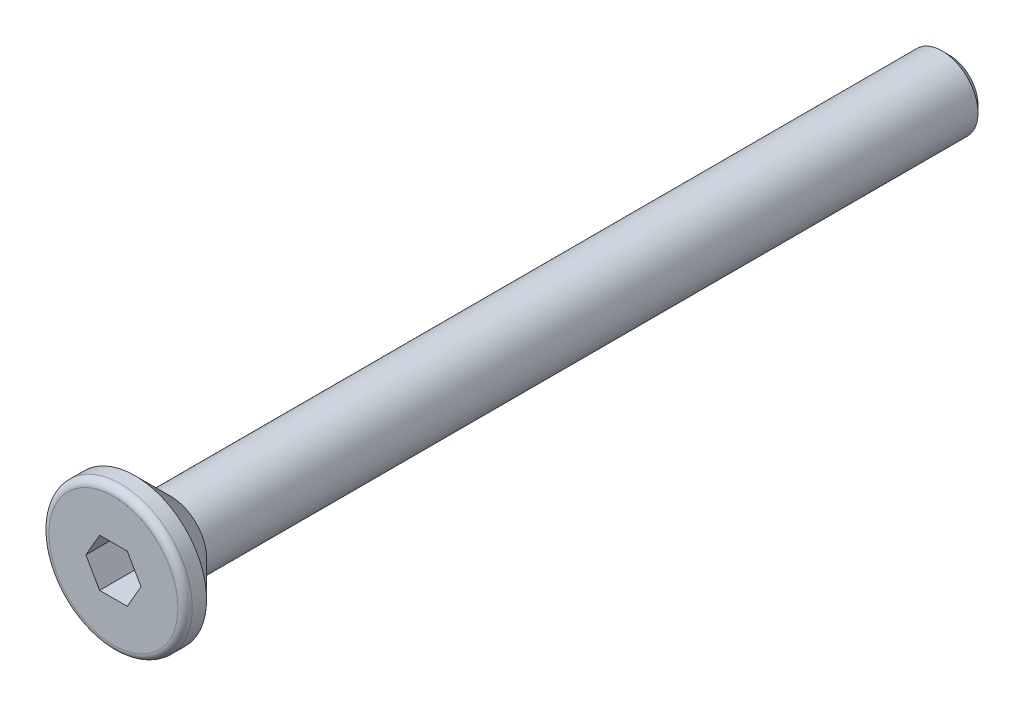
ISO-10303-21;
HEADER;
FILE_DESCRIPTION(('STEP AP214'),'2;1');
FILE_NAME('part.step','',(''),(''),'','','');
FILE_SCHEMA(('AUTOMOTIVE_DESIGN { 1 0 10303 214 1 1 1 1 }'));
ENDSEC;
DATA;
#1=APPLICATION_CONTEXT('core data for automotive mechanical design processes');
#2=APPLICATION_PROTOCOL_DEFINITION('international standard','automotive_design',2000,#1);
#3=PRODUCT_CONTEXT('',#1,'mechanical');
#4=PRODUCT('Part','Part','',(#3));
#5=PRODUCT_RELATED_PRODUCT_CATEGORY('part','',(#4));
#6=PRODUCT_DEFINITION_FORMATION('','',#4);
#7=PRODUCT_DEFINITION_CONTEXT('part definition',#1,'design');
#8=PRODUCT_DEFINITION('design','',#6,#7);
#9=PRODUCT_DEFINITION_SHAPE('','',#8);
#10=(LENGTH_UNIT() NAMED_UNIT(*) SI_UNIT(.MILLI.,.METRE.));
#11=(NAMED_UNIT(*) PLANE_ANGLE_UNIT() SI_UNIT($,.RADIAN.));
#12=(NAMED_UNIT(*) SI_UNIT($,.STERADIAN.) SOLID_ANGLE_UNIT());
#13=UNCERTAINTY_MEASURE_WITH_UNIT(LENGTH_MEASURE(1.E-05),#10,'distance_accuracy_value','');
#14=(GEOMETRIC_REPRESENTATION_CONTEXT(3) GLOBAL_UNCERTAINTY_ASSIGNED_CONTEXT((#13)) GLOBAL_UNIT_ASSIGNED_CONTEXT((#10,
#11,#12)) REPRESENTATION_CONTEXT('',''));
#15=CARTESIAN_POINT('',(0.,0.,0.));
#16=DIRECTION('',(0.,0.,1.));
#17=DIRECTION('',(1.,0.,0.));
#18=AXIS2_PLACEMENT_3D('',#15,#16,#17);
#19=CARTESIAN_POINT('',(0.,0.,17.5));
#20=DIRECTION('',(0.,0.,1.));
#21=DIRECTION('',(1.,0.,0.));
#22=AXIS2_PLACEMENT_3D('',#19,#20,#21);
#23=PLANE('',#22);
#24=CARTESIAN_POINT('',(0.,0.,17.5));
#25=DIRECTION('',(0.,0.,1.));
#26=DIRECTION('',(1.,0.,0.));
#27=AXIS2_PLACEMENT_3D('',#24,#25,#26);
#28=CIRCLE('',#27,2.7);
#29=CARTESIAN_POINT('',(2.7,0.,17.5));
#30=VERTEX_POINT('',#29);
#31=EDGE_CURVE('E11',#30,#30,#28,.T.);
#32=ORIENTED_EDGE('',*,*,#31,.T.);
#33=EDGE_LOOP('',(#32));
#34=FACE_BOUND('',#33,.T.);
#35=DIRECTION('',(0.5,0.866025403784439,0.));
#36=VECTOR('',#35,1.);
#37=CARTESIAN_POINT('',(0.577350269189626,-1.,17.5));
#38=LINE('',#37,#36);
#39=CARTESIAN_POINT('',(0.577350269189626,-1.,17.5));
#40=VERTEX_POINT('',#39);
#41=CARTESIAN_POINT('',(1.15470053837925,0.,17.5));
#42=VERTEX_POINT('',#41);
#43=EDGE_CURVE('E48',#40,#42,#38,.T.);
#44=ORIENTED_EDGE('',*,*,#43,.F.);
#45=DIRECTION('',(1.,0.,0.));
#46=VECTOR('',#45,1.);
#47=CARTESIAN_POINT('',(-0.577350269189626,-1.,17.5));
#48=LINE('',#47,#46);
#49=CARTESIAN_POINT('',(-0.577350269189626,-1.,17.5));
#50=VERTEX_POINT('',#49);
#51=EDGE_CURVE('E131',#50,#40,#48,.T.);
#52=ORIENTED_EDGE('',*,*,#51,.F.);
#53=DIRECTION('',(0.5,-0.866025403784438,0.));
#54=VECTOR('',#53,1.);
#55=CARTESIAN_POINT('',(-1.15470053837925,0.,17.5));
#56=LINE('',#55,#54);
#57=CARTESIAN_POINT('',(-1.15470053837925,0.,17.5));
#58=VERTEX_POINT('',#57);
#59=EDGE_CURVE('E129',#58,#50,#56,.T.);
#60=ORIENTED_EDGE('',*,*,#59,.F.);
#61=DIRECTION('',(-0.5,-0.866025403784439,0.));
#62=VECTOR('',#61,1.);
#63=CARTESIAN_POINT('',(-0.577350269189626,1.,17.5));
#64=LINE('',#63,#62);
#65=CARTESIAN_POINT('',(-0.577350269189626,1.,17.5));
#66=VERTEX_POINT('',#65);
#67=EDGE_CURVE('E96',#66,#58,#64,.T.);
#68=ORIENTED_EDGE('',*,*,#67,.F.);
#69=DIRECTION('',(-1.,0.,0.));
#70=VECTOR('',#69,1.);
#71=CARTESIAN_POINT('',(0.577350269189626,1.,17.5));
#72=LINE('',#71,#70);
#73=CARTESIAN_POINT('',(0.577350269189626,1.,17.5));
#74=VERTEX_POINT('',#73);
#75=EDGE_CURVE('E125',#74,#66,#72,.T.);
#76=ORIENTED_EDGE('',*,*,#75,.F.);
#77=DIRECTION('',(-0.5,0.866025403784438,0.));
#78=VECTOR('',#77,1.);
#79=CARTESIAN_POINT('',(1.15470053837925,0.,17.5));
#80=LINE('',#79,#78);
#81=EDGE_CURVE('E122',#42,#74,#80,.T.);
#82=ORIENTED_EDGE('',*,*,#81,.F.);
#83=EDGE_LOOP('',(#44,#52,#60,#68,#76,#82));
#84=FACE_BOUND('',#83,.T.);
#85=ADVANCED_FACE('F33',(#34,#84),#23,.T.);
#86=CARTESIAN_POINT('',(0.,0.,-17.5));
#87=DIRECTION('',(0.,0.,-1.));
#88=DIRECTION('',(-1.,0.,0.));
#89=AXIS2_PLACEMENT_3D('',#86,#87,#88);
#90=CYLINDRICAL_SURFACE('',#89,3.);
#91=CARTESIAN_POINT('',(0.,0.,17.2));
#92=DIRECTION('',(0.,0.,1.));
#93=DIRECTION('',(1.,0.,0.));
#94=AXIS2_PLACEMENT_3D('',#91,#92,#93);
#95=CIRCLE('',#94,3.);
#96=CARTESIAN_POINT('',(3.,0.,17.2));
#97=VERTEX_POINT('',#96);
#98=EDGE_CURVE('E41',#97,#97,#95,.F.);
#99=ORIENTED_EDGE('',*,*,#98,.T.);
#100=EDGE_LOOP('',(#99));
#101=FACE_BOUND('',#100,.T.);
#102=CARTESIAN_POINT('',(0.,0.,16.6));
#103=DIRECTION('',(0.,0.,-1.));
#104=DIRECTION('',(-1.,0.,0.));
#105=AXIS2_PLACEMENT_3D('',#102,#103,#104);
#106=CIRCLE('',#105,3.);
#107=CARTESIAN_POINT('',(-3.,0.,16.6));
#108=VERTEX_POINT('',#107);
#109=EDGE_CURVE('E149',#108,#108,#106,.T.);
#110=ORIENTED_EDGE('',*,*,#109,.F.);
#111=EDGE_LOOP('',(#110));
#112=FACE_BOUND('',#111,.T.);
#113=ADVANCED_FACE('F154',(#101,#112),#90,.T.);
#114=CARTESIAN_POINT('',(0.,0.,15.1));
#115=DIRECTION('',(0.,0.,1.));
#116=DIRECTION('',(1.,0.,0.));
#117=AXIS2_PLACEMENT_3D('',#114,#115,#116);
#118=CONICAL_SURFACE('',#117,1.5,0.785398163397443);
#119=ORIENTED_EDGE('',*,*,#109,.T.);
#120=EDGE_LOOP('',(#119));
#121=FACE_BOUND('',#120,.T.);
#122=CARTESIAN_POINT('',(0.,0.,15.1));
#123=DIRECTION('',(0.,0.,-1.));
#124=DIRECTION('',(-1.,0.,0.));
#125=AXIS2_PLACEMENT_3D('',#122,#123,#124);
#126=CIRCLE('',#125,1.5);
#127=CARTESIAN_POINT('',(-1.5,0.,15.1));
#128=VERTEX_POINT('',#127);
#129=EDGE_CURVE('E146',#128,#128,#126,.T.);
#130=ORIENTED_EDGE('',*,*,#129,.F.);
#131=EDGE_LOOP('',(#130));
#132=FACE_BOUND('',#131,.T.);
#133=ADVANCED_FACE('F170',(#121,#132),#118,.T.);
#134=CARTESIAN_POINT('',(0.,0.,-17.5));
#135=DIRECTION('',(0.,0.,-1.));
#136=DIRECTION('',(-1.,0.,0.));
#137=AXIS2_PLACEMENT_3D('',#134,#135,#136);
#138=CYLINDRICAL_SURFACE('',#137,1.5);
#139=ORIENTED_EDGE('',*,*,#129,.T.);
#140=EDGE_LOOP('',(#139));
#141=FACE_BOUND('',#140,.T.);
#142=CARTESIAN_POINT('',(0.,0.,-17.2));
#143=DIRECTION('',(0.,0.,-1.));
#144=DIRECTION('',(-1.,0.,0.));
#145=AXIS2_PLACEMENT_3D('',#142,#143,#144);
#146=CIRCLE('',#145,1.5);
#147=CARTESIAN_POINT('',(-1.5,0.,-17.2));
#148=VERTEX_POINT('',#147);
#149=EDGE_CURVE('E143',#148,#148,#146,.T.);
#150=ORIENTED_EDGE('',*,*,#149,.F.);
#151=EDGE_LOOP('',(#150));
#152=FACE_BOUND('',#151,.T.);
#153=ADVANCED_FACE('F176',(#141,#152),#138,.T.);
#154=CARTESIAN_POINT('',(0.,0.,-17.5));
#155=DIRECTION('',(0.,0.,1.));
#156=DIRECTION('',(1.,0.,0.));
#157=AXIS2_PLACEMENT_3D('',#154,#155,#156);
#158=CONICAL_SURFACE('',#157,1.2,0.785398163397443);
#159=ORIENTED_EDGE('',*,*,#149,.T.);
#160=EDGE_LOOP('',(#159));
#161=FACE_BOUND('',#160,.T.);
#162=CARTESIAN_POINT('',(0.,0.,-17.5));
#163=DIRECTION('',(0.,0.,-1.));
#164=DIRECTION('',(-1.,0.,0.));
#165=AXIS2_PLACEMENT_3D('',#162,#163,#164);
#166=CIRCLE('',#165,1.2);
#167=CARTESIAN_POINT('',(-1.2,0.,-17.5));
#168=VERTEX_POINT('',#167);
#169=EDGE_CURVE('E135',#168,#168,#166,.T.);
#170=ORIENTED_EDGE('',*,*,#169,.F.);
#171=EDGE_LOOP('',(#170));
#172=FACE_BOUND('',#171,.T.);
#173=ADVANCED_FACE('F180',(#161,#172),#158,.T.);
#174=CARTESIAN_POINT('',(0.,1.2,-17.5));
#175=DIRECTION('',(0.,0.,-1.));
#176=DIRECTION('',(-1.,0.,0.));
#177=AXIS2_PLACEMENT_3D('',#174,#175,#176);
#178=PLANE('',#177);
#179=ORIENTED_EDGE('',*,*,#169,.T.);
#180=EDGE_LOOP('',(#179));
#181=FACE_BOUND('',#180,.T.);
#182=ADVANCED_FACE('F184',(#181),#178,.T.);
#183=CARTESIAN_POINT('',(0.577350269189626,-1.,16.));
#184=DIRECTION('',(0.866025403784438,-0.5,0.));
#185=DIRECTION('',(0.5,0.866025403784439,0.));
#186=AXIS2_PLACEMENT_3D('',#183,#184,#185);
#187=PLANE('',#186);
#188=ORIENTED_EDGE('',*,*,#43,.T.);
#189=DIRECTION('',(0.,0.,1.));
#190=VECTOR('',#189,1.);
#191=CARTESIAN_POINT('',(1.15470053837925,0.,16.));
#192=LINE('',#191,#190);
#193=CARTESIAN_POINT('',(1.15470053837925,0.,16.));
#194=VERTEX_POINT('',#193);
#195=EDGE_CURVE('E78',#194,#42,#192,.T.);
#196=ORIENTED_EDGE('',*,*,#195,.F.);
#197=DIRECTION('',(0.5,0.866025403784439,0.));
#198=VECTOR('',#197,1.);
#199=CARTESIAN_POINT('',(0.577350269189626,-1.,16.));
#200=LINE('',#199,#198);
#201=CARTESIAN_POINT('',(0.577350269189626,-1.,16.));
#202=VERTEX_POINT('',#201);
#203=EDGE_CURVE('E133',#202,#194,#200,.T.);
#204=ORIENTED_EDGE('',*,*,#203,.F.);
#205=DIRECTION('',(0.,0.,1.));
#206=VECTOR('',#205,1.);
#207=CARTESIAN_POINT('',(0.577350269189626,-1.,16.));
#208=LINE('',#207,#206);
#209=EDGE_CURVE('E56',#202,#40,#208,.T.);
#210=ORIENTED_EDGE('',*,*,#209,.T.);
#211=EDGE_LOOP('',(#188,#196,#204,#210));
#212=FACE_BOUND('',#211,.T.);
#213=ADVANCED_FACE('F188',(#212),#187,.F.);
#214=CARTESIAN_POINT('',(-0.577350269189626,-1.,16.));
#215=DIRECTION('',(0.,-1.,0.));
#216=DIRECTION('',(1.,0.,0.));
#217=AXIS2_PLACEMENT_3D('',#214,#215,#216);
#218=PLANE('',#217);
#219=ORIENTED_EDGE('',*,*,#51,.T.);
#220=ORIENTED_EDGE('',*,*,#209,.F.);
#221=DIRECTION('',(1.,0.,0.));
#222=VECTOR('',#221,1.);
#223=CARTESIAN_POINT('',(-0.577350269189626,-1.,16.));
#224=LINE('',#223,#222);
#225=CARTESIAN_POINT('',(-0.577350269189626,-1.,16.));
#226=VERTEX_POINT('',#225);
#227=EDGE_CURVE('E108',#226,#202,#224,.T.);
#228=ORIENTED_EDGE('',*,*,#227,.F.);
#229=DIRECTION('',(0.,0.,1.));
#230=VECTOR('',#229,1.);
#231=CARTESIAN_POINT('',(-0.577350269189626,-1.,16.));
#232=LINE('',#231,#230);
#233=EDGE_CURVE('E100',#226,#50,#232,.T.);
#234=ORIENTED_EDGE('',*,*,#233,.T.);
#235=EDGE_LOOP('',(#219,#220,#228,#234));
#236=FACE_BOUND('',#235,.T.);
#237=ADVANCED_FACE('F192',(#236),#218,.F.);
#238=CARTESIAN_POINT('',(-1.15470053837925,0.,16.));
#239=DIRECTION('',(-0.866025403784439,-0.5,0.));
#240=DIRECTION('',(0.5,-0.866025403784439,0.));
#241=AXIS2_PLACEMENT_3D('',#238,#239,#240);
#242=PLANE('',#241);
#243=ORIENTED_EDGE('',*,*,#59,.T.);
#244=ORIENTED_EDGE('',*,*,#233,.F.);
#245=DIRECTION('',(0.5,-0.866025403784438,0.));
#246=VECTOR('',#245,1.);
#247=CARTESIAN_POINT('',(-1.15470053837925,0.,16.));
#248=LINE('',#247,#246);
#249=CARTESIAN_POINT('',(-1.15470053837925,0.,16.));
#250=VERTEX_POINT('',#249);
#251=EDGE_CURVE('E104',#250,#226,#248,.T.);
#252=ORIENTED_EDGE('',*,*,#251,.F.);
#253=DIRECTION('',(0.,0.,1.));
#254=VECTOR('',#253,1.);
#255=CARTESIAN_POINT('',(-1.15470053837925,0.,16.));
#256=LINE('',#255,#254);
#257=EDGE_CURVE('E89',#250,#58,#256,.T.);
#258=ORIENTED_EDGE('',*,*,#257,.T.);
#259=EDGE_LOOP('',(#243,#244,#252,#258));
#260=FACE_BOUND('',#259,.T.);
#261=ADVANCED_FACE('F105',(#260),#242,.F.);
#262=CARTESIAN_POINT('',(-0.577350269189626,1.,16.));
#263=DIRECTION('',(-0.866025403784439,0.5,0.));
#264=DIRECTION('',(-0.5,-0.866025403784439,0.));
#265=AXIS2_PLACEMENT_3D('',#262,#263,#264);
#266=PLANE('',#265);
#267=ORIENTED_EDGE('',*,*,#67,.T.);
#268=ORIENTED_EDGE('',*,*,#257,.F.);
#269=DIRECTION('',(-0.5,-0.866025403784439,0.));
#270=VECTOR('',#269,1.);
#271=CARTESIAN_POINT('',(-0.577350269189626,1.,16.));
#272=LINE('',#271,#270);
#273=CARTESIAN_POINT('',(-0.577350269189626,1.,16.));
#274=VERTEX_POINT('',#273);
#275=EDGE_CURVE('E93',#274,#250,#272,.T.);
#276=ORIENTED_EDGE('',*,*,#275,.F.);
#277=DIRECTION('',(0.,0.,1.));
#278=VECTOR('',#277,1.);
#279=CARTESIAN_POINT('',(-0.577350269189626,1.,16.));
#280=LINE('',#279,#278);
#281=EDGE_CURVE('E101',#274,#66,#280,.T.);
#282=ORIENTED_EDGE('',*,*,#281,.T.);
#283=EDGE_LOOP('',(#267,#268,#276,#282));
#284=FACE_BOUND('',#283,.T.);
#285=ADVANCED_FACE('F91',(#284),#266,.F.);
#286=CARTESIAN_POINT('',(0.577350269189626,1.,16.));
#287=DIRECTION('',(0.,1.,0.));
#288=DIRECTION('',(-1.,0.,0.));
#289=AXIS2_PLACEMENT_3D('',#286,#287,#288);
#290=PLANE('',#289);
#291=ORIENTED_EDGE('',*,*,#75,.T.);
#292=ORIENTED_EDGE('',*,*,#281,.F.);
#293=DIRECTION('',(-1.,0.,0.));
#294=VECTOR('',#293,1.);
#295=CARTESIAN_POINT('',(0.577350269189626,1.,16.));
#296=LINE('',#295,#294);
#297=CARTESIAN_POINT('',(0.577350269189626,1.,16.));
#298=VERTEX_POINT('',#297);
#299=EDGE_CURVE('E114',#298,#274,#296,.T.);
#300=ORIENTED_EDGE('',*,*,#299,.F.);
#301=DIRECTION('',(0.,0.,1.));
#302=VECTOR('',#301,1.);
#303=CARTESIAN_POINT('',(0.577350269189626,1.,16.));
#304=LINE('',#303,#302);
#305=EDGE_CURVE('E138',#298,#74,#304,.T.);
#306=ORIENTED_EDGE('',*,*,#305,.T.);
#307=EDGE_LOOP('',(#291,#292,#300,#306));
#308=FACE_BOUND('',#307,.T.);
#309=ADVANCED_FACE('F195',(#308),#290,.F.);
#310=CARTESIAN_POINT('',(1.15470053837925,0.,16.));
#311=DIRECTION('',(0.866025403784439,0.5,0.));
#312=DIRECTION('',(-0.5,0.866025403784439,0.));
#313=AXIS2_PLACEMENT_3D('',#310,#311,#312);
#314=PLANE('',#313);
#315=ORIENTED_EDGE('',*,*,#81,.T.);
#316=ORIENTED_EDGE('',*,*,#305,.F.);
#317=DIRECTION('',(-0.5,0.866025403784438,0.));
#318=VECTOR('',#317,1.);
#319=CARTESIAN_POINT('',(1.15470053837925,0.,16.));
#320=LINE('',#319,#318);
#321=EDGE_CURVE('E116',#194,#298,#320,.T.);
#322=ORIENTED_EDGE('',*,*,#321,.F.);
#323=ORIENTED_EDGE('',*,*,#195,.T.);
#324=EDGE_LOOP('',(#315,#316,#322,#323));
#325=FACE_BOUND('',#324,.T.);
#326=ADVANCED_FACE('F162',(#325),#314,.F.);
#327=CARTESIAN_POINT('',(0.,0.,16.));
#328=DIRECTION('',(0.,0.,1.));
#329=DIRECTION('',(1.,0.,0.));
#330=AXIS2_PLACEMENT_3D('',#327,#328,#329);
#331=PLANE('',#330);
#332=ORIENTED_EDGE('',*,*,#203,.T.);
#333=ORIENTED_EDGE('',*,*,#321,.T.);
#334=ORIENTED_EDGE('',*,*,#299,.T.);
#335=ORIENTED_EDGE('',*,*,#275,.T.);
#336=ORIENTED_EDGE('',*,*,#251,.T.);
#337=ORIENTED_EDGE('',*,*,#227,.T.);
#338=EDGE_LOOP('',(#332,#333,#334,#335,#336,#337));
#339=FACE_BOUND('',#338,.T.);
#340=ADVANCED_FACE('F111',(#339),#331,.T.);
#341=CARTESIAN_POINT('',(0.,0.,17.2));
#342=DIRECTION('',(0.,0.,1.));
#343=DIRECTION('',(1.,0.,0.));
#344=AXIS2_PLACEMENT_3D('',#341,#342,#343);
#345=TOROIDAL_SURFACE('',#344,2.7,0.3);
#346=ORIENTED_EDGE('',*,*,#31,.F.);
#347=EDGE_LOOP('',(#346));
#348=FACE_BOUND('',#347,.T.);
#349=ORIENTED_EDGE('',*,*,#98,.F.);
#350=EDGE_LOOP('',(#349));
#351=FACE_BOUND('',#350,.T.);
#352=ADVANCED_FACE('F35',(#348,#351),#345,.T.);
#353=CLOSED_SHELL('',(#85,#113,#133,#153,#173,#182,#213,#237,#261,#285,#309,#326,#340,#352));
#354=MANIFOLD_SOLID_BREP('B2',#353);
#355=ADVANCED_BREP_SHAPE_REPRESENTATION('',(#18,#354),#14);
#356=SHAPE_DEFINITION_REPRESENTATION(#9,#355);
ENDSEC;
END-ISO-10303-21;
